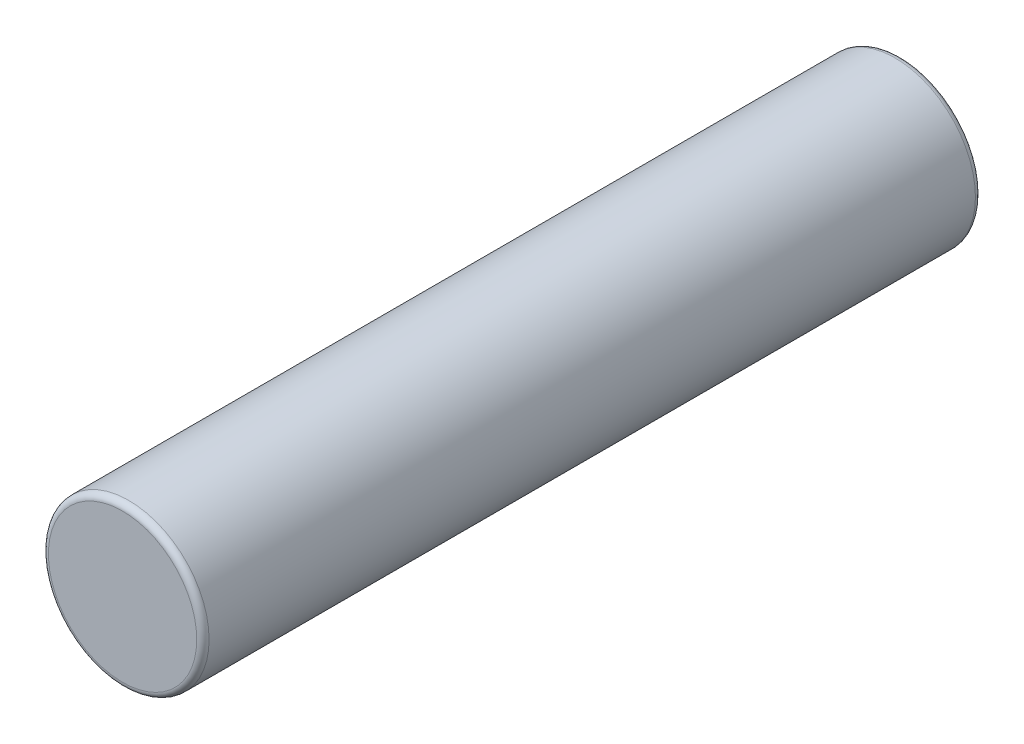
ISO-10303-21;
HEADER;
FILE_DESCRIPTION(('STEP AP214'),'2;1');
FILE_NAME('part.step','',(''),(''),'','','');
FILE_SCHEMA(('AUTOMOTIVE_DESIGN { 1 0 10303 214 1 1 1 1 }'));
ENDSEC;
DATA;
#1=APPLICATION_CONTEXT('core data for automotive mechanical design processes');
#2=APPLICATION_PROTOCOL_DEFINITION('international standard','automotive_design',2000,#1);
#3=PRODUCT_CONTEXT('',#1,'mechanical');
#4=PRODUCT('Part','Part','',(#3));
#5=PRODUCT_RELATED_PRODUCT_CATEGORY('part','',(#4));
#6=PRODUCT_DEFINITION_FORMATION('','',#4);
#7=PRODUCT_DEFINITION_CONTEXT('part definition',#1,'design');
#8=PRODUCT_DEFINITION('design','',#6,#7);
#9=PRODUCT_DEFINITION_SHAPE('','',#8);
#10=(LENGTH_UNIT() NAMED_UNIT(*) SI_UNIT(.MILLI.,.METRE.));
#11=(NAMED_UNIT(*) PLANE_ANGLE_UNIT() SI_UNIT($,.RADIAN.));
#12=(NAMED_UNIT(*) SI_UNIT($,.STERADIAN.) SOLID_ANGLE_UNIT());
#13=UNCERTAINTY_MEASURE_WITH_UNIT(LENGTH_MEASURE(1.E-05),#10,'distance_accuracy_value','');
#14=(GEOMETRIC_REPRESENTATION_CONTEXT(3) GLOBAL_UNCERTAINTY_ASSIGNED_CONTEXT((#13)) GLOBAL_UNIT_ASSIGNED_CONTEXT((#10,
#11,#12)) REPRESENTATION_CONTEXT('',''));
#15=CARTESIAN_POINT('',(0.,0.,0.));
#16=DIRECTION('',(0.,0.,1.));
#17=DIRECTION('',(1.,0.,0.));
#18=AXIS2_PLACEMENT_3D('',#15,#16,#17);
#19=CARTESIAN_POINT('',(0.,0.,63.));
#20=DIRECTION('',(0.,0.,-1.));
#21=DIRECTION('',(-1.,0.,0.));
#22=AXIS2_PLACEMENT_3D('',#19,#20,#21);
#23=CYLINDRICAL_SURFACE('',#22,6.5);
#24=CARTESIAN_POINT('',(0.,0.,0.5));
#25=DIRECTION('',(0.,0.,1.));
#26=DIRECTION('',(1.,0.,0.));
#27=AXIS2_PLACEMENT_3D('',#24,#25,#26);
#28=CIRCLE('',#27,6.5);
#29=CARTESIAN_POINT('',(6.5,0.,0.5));
#30=VERTEX_POINT('',#29);
#31=EDGE_CURVE('E50',#30,#30,#28,.T.);
#32=ORIENTED_EDGE('',*,*,#31,.T.);
#33=EDGE_LOOP('',(#32));
#34=FACE_BOUND('',#33,.T.);
#35=CARTESIAN_POINT('',(0.,0.,62.5));
#36=DIRECTION('',(0.,0.,1.));
#37=DIRECTION('',(1.,0.,0.));
#38=AXIS2_PLACEMENT_3D('',#35,#36,#37);
#39=CIRCLE('',#38,6.5);
#40=CARTESIAN_POINT('',(6.5,0.,62.5));
#41=VERTEX_POINT('',#40);
#42=EDGE_CURVE('E55',#41,#41,#39,.F.);
#43=ORIENTED_EDGE('',*,*,#42,.T.);
#44=EDGE_LOOP('',(#43));
#45=FACE_BOUND('',#44,.T.);
#46=ADVANCED_FACE('F37',(#34,#45),#23,.T.);
#47=CARTESIAN_POINT('',(0.,0.,63.));
#48=DIRECTION('',(0.,0.,1.));
#49=DIRECTION('',(1.,0.,0.));
#50=AXIS2_PLACEMENT_3D('',#47,#48,#49);
#51=PLANE('',#50);
#52=CARTESIAN_POINT('',(0.,0.,63.));
#53=DIRECTION('',(0.,0.,1.));
#54=DIRECTION('',(1.,0.,0.));
#55=AXIS2_PLACEMENT_3D('',#52,#53,#54);
#56=CIRCLE('',#55,6.);
#57=CARTESIAN_POINT('',(6.,0.,63.));
#58=VERTEX_POINT('',#57);
#59=EDGE_CURVE('E10',#58,#58,#56,.T.);
#60=ORIENTED_EDGE('',*,*,#59,.T.);
#61=EDGE_LOOP('',(#60));
#62=FACE_BOUND('',#61,.T.);
#63=ADVANCED_FACE('F72',(#62),#51,.T.);
#64=CARTESIAN_POINT('',(0.,0.,0.));
#65=DIRECTION('',(0.,0.,1.));
#66=DIRECTION('',(1.,0.,0.));
#67=AXIS2_PLACEMENT_3D('',#64,#65,#66);
#68=PLANE('',#67);
#69=CARTESIAN_POINT('',(0.,0.,0.));
#70=DIRECTION('',(0.,0.,1.));
#71=DIRECTION('',(1.,0.,0.));
#72=AXIS2_PLACEMENT_3D('',#69,#70,#71);
#73=CIRCLE('',#72,6.);
#74=CARTESIAN_POINT('',(6.,0.,0.));
#75=VERTEX_POINT('',#74);
#76=EDGE_CURVE('E45',#75,#75,#73,.F.);
#77=ORIENTED_EDGE('',*,*,#76,.T.);
#78=EDGE_LOOP('',(#77));
#79=FACE_BOUND('',#78,.T.);
#80=ADVANCED_FACE('F69',(#79),#68,.F.);
#81=CARTESIAN_POINT('',(0.,0.,0.5));
#82=DIRECTION('',(0.,0.,1.));
#83=DIRECTION('',(1.,0.,0.));
#84=AXIS2_PLACEMENT_3D('',#81,#82,#83);
#85=TOROIDAL_SURFACE('',#84,6.,0.5);
#86=ORIENTED_EDGE('',*,*,#76,.F.);
#87=EDGE_LOOP('',(#86));
#88=FACE_BOUND('',#87,.T.);
#89=ORIENTED_EDGE('',*,*,#31,.F.);
#90=EDGE_LOOP('',(#89));
#91=FACE_BOUND('',#90,.T.);
#92=ADVANCED_FACE('F65',(#88,#91),#85,.T.);
#93=CARTESIAN_POINT('',(0.,0.,62.5));
#94=DIRECTION('',(0.,0.,1.));
#95=DIRECTION('',(1.,0.,0.));
#96=AXIS2_PLACEMENT_3D('',#93,#94,#95);
#97=TOROIDAL_SURFACE('',#96,6.,0.5);
#98=ORIENTED_EDGE('',*,*,#42,.F.);
#99=EDGE_LOOP('',(#98));
#100=FACE_BOUND('',#99,.T.);
#101=ORIENTED_EDGE('',*,*,#59,.F.);
#102=EDGE_LOOP('',(#101));
#103=FACE_BOUND('',#102,.T.);
#104=ADVANCED_FACE('F39',(#100,#103),#97,.T.);
#105=CLOSED_SHELL('',(#46,#63,#80,#92,#104));
#106=MANIFOLD_SOLID_BREP('B2',#105);
#107=ADVANCED_BREP_SHAPE_REPRESENTATION('',(#18,#106),#14);
#108=SHAPE_DEFINITION_REPRESENTATION(#9,#107);
ENDSEC;
END-ISO-10303-21;
